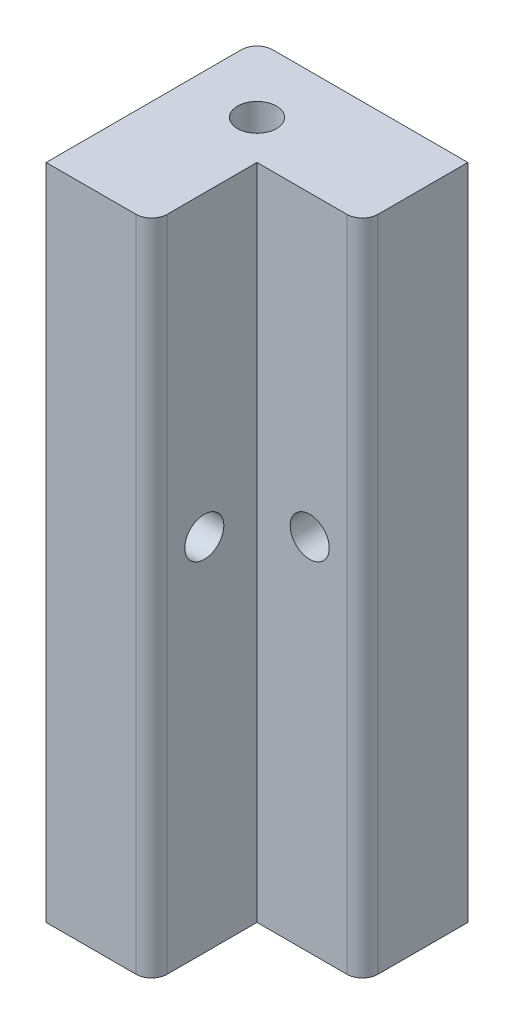
ISO-10303-21;
HEADER;
FILE_DESCRIPTION(('STEP AP214'),'2;1');
FILE_NAME('part.step','',(''),(''),'','','');
FILE_SCHEMA(('AUTOMOTIVE_DESIGN { 1 0 10303 214 1 1 1 1 }'));
ENDSEC;
DATA;
#1=APPLICATION_CONTEXT('core data for automotive mechanical design processes');
#2=APPLICATION_PROTOCOL_DEFINITION('international standard','automotive_design',2000,#1);
#3=PRODUCT_CONTEXT('',#1,'mechanical');
#4=PRODUCT('Part','Part','',(#3));
#5=PRODUCT_RELATED_PRODUCT_CATEGORY('part','',(#4));
#6=PRODUCT_DEFINITION_FORMATION('','',#4);
#7=PRODUCT_DEFINITION_CONTEXT('part definition',#1,'design');
#8=PRODUCT_DEFINITION('design','',#6,#7);
#9=PRODUCT_DEFINITION_SHAPE('','',#8);
#10=(LENGTH_UNIT() NAMED_UNIT(*) SI_UNIT(.MILLI.,.METRE.));
#11=(NAMED_UNIT(*) PLANE_ANGLE_UNIT() SI_UNIT($,.RADIAN.));
#12=(NAMED_UNIT(*) SI_UNIT($,.STERADIAN.) SOLID_ANGLE_UNIT());
#13=UNCERTAINTY_MEASURE_WITH_UNIT(LENGTH_MEASURE(1.E-05),#10,'distance_accuracy_value','');
#14=(GEOMETRIC_REPRESENTATION_CONTEXT(3) GLOBAL_UNCERTAINTY_ASSIGNED_CONTEXT((#13)) GLOBAL_UNIT_ASSIGNED_CONTEXT((#10,
#11,#12)) REPRESENTATION_CONTEXT('',''));
#15=CARTESIAN_POINT('',(0.,0.,0.));
#16=DIRECTION('',(0.,0.,1.));
#17=DIRECTION('',(1.,0.,0.));
#18=AXIS2_PLACEMENT_3D('',#15,#16,#17);
#19=CARTESIAN_POINT('',(5.,83.3618830920393,-8.5));
#20=DIRECTION('',(-1.,0.,0.));
#21=DIRECTION('',(0.,0.,1.));
#22=AXIS2_PLACEMENT_3D('',#19,#20,#21);
#23=PLANE('',#22);
#24=CARTESIAN_POINT('',(5.,46.1350000000003,11.75));
#25=DIRECTION('',(-1.,0.,0.));
#26=DIRECTION('',(0.,0.,1.));
#27=AXIS2_PLACEMENT_3D('',#24,#25,#26);
#28=CIRCLE('',#27,2.5);
#29=CARTESIAN_POINT('',(5.,46.1350000000003,14.25));
#30=VERTEX_POINT('',#29);
#31=EDGE_CURVE('E201',#30,#30,#28,.T.);
#32=ORIENTED_EDGE('',*,*,#31,.T.);
#33=EDGE_LOOP('',(#32));
#34=FACE_BOUND('',#33,.T.);
#35=DIRECTION('',(0.,-1.,0.));
#36=VECTOR('',#35,1.);
#37=CARTESIAN_POINT('',(5.,64.2700000000025,5.));
#38=LINE('',#37,#36);
#39=CARTESIAN_POINT('',(4.99999999999993,84.2700000000025,5.00000000000007));
#40=VERTEX_POINT('',#39);
#41=CARTESIAN_POINT('',(5.,0.,4.99999999999999));
#42=VERTEX_POINT('',#41);
#43=EDGE_CURVE('E128',#40,#42,#38,.T.);
#44=ORIENTED_EDGE('',*,*,#43,.F.);
#45=DIRECTION('',(0.,0.,-1.));
#46=VECTOR('',#45,1.);
#47=CARTESIAN_POINT('',(4.99999999999993,84.2700000000025,3.08297844300654E-13));
#48=LINE('',#47,#46);
#49=CARTESIAN_POINT('',(4.99999999999993,84.2700000000024,16.5000000000001));
#50=VERTEX_POINT('',#49);
#51=EDGE_CURVE('E131',#50,#40,#48,.T.);
#52=ORIENTED_EDGE('',*,*,#51,.F.);
#53=DIRECTION('',(0.,1.,0.));
#54=VECTOR('',#53,1.);
#55=CARTESIAN_POINT('',(5.,83.3618830920393,16.5));
#56=LINE('',#55,#54);
#57=CARTESIAN_POINT('',(5.,0.,16.5));
#58=VERTEX_POINT('',#57);
#59=EDGE_CURVE('E232',#50,#58,#56,.F.);
#60=ORIENTED_EDGE('',*,*,#59,.T.);
#61=DIRECTION('',(0.,0.,-1.));
#62=VECTOR('',#61,1.);
#63=CARTESIAN_POINT('',(5.,0.,-8.5));
#64=LINE('',#63,#62);
#65=EDGE_CURVE('E133',#58,#42,#64,.T.);
#66=ORIENTED_EDGE('',*,*,#65,.T.);
#67=EDGE_LOOP('',(#44,#52,#60,#66));
#68=FACE_BOUND('',#67,.T.);
#69=ADVANCED_FACE('F40',(#34,#68),#23,.F.);
#70=CARTESIAN_POINT('',(0.,0.,0.));
#71=DIRECTION('',(0.,-1.,0.));
#72=DIRECTION('',(0.,0.,-1.));
#73=AXIS2_PLACEMENT_3D('',#70,#71,#72);
#74=PLANE('',#73);
#75=DIRECTION('',(0.,0.,-1.));
#76=VECTOR('',#75,1.);
#77=CARTESIAN_POINT('',(18.5,0.,-8.5));
#78=LINE('',#77,#76);
#79=CARTESIAN_POINT('',(18.5,0.,2.99999999999999));
#80=VERTEX_POINT('',#79);
#81=CARTESIAN_POINT('',(18.5,0.,-8.5));
#82=VERTEX_POINT('',#81);
#83=EDGE_CURVE('E194',#80,#82,#78,.T.);
#84=ORIENTED_EDGE('',*,*,#83,.F.);
#85=CARTESIAN_POINT('',(16.5,0.,2.99999999999999));
#86=DIRECTION('',(0.,-1.,0.));
#87=DIRECTION('',(0.,0.,-1.));
#88=AXIS2_PLACEMENT_3D('',#85,#86,#87);
#89=CIRCLE('',#88,2.);
#90=CARTESIAN_POINT('',(16.5,0.,4.99999999999999));
#91=VERTEX_POINT('',#90);
#92=EDGE_CURVE('E49',#80,#91,#89,.T.);
#93=ORIENTED_EDGE('',*,*,#92,.T.);
#94=DIRECTION('',(-1.,0.,0.));
#95=VECTOR('',#94,1.);
#96=CARTESIAN_POINT('',(18.5,0.,4.99999999999999));
#97=LINE('',#96,#95);
#98=EDGE_CURVE('E196',#91,#42,#97,.T.);
#99=ORIENTED_EDGE('',*,*,#98,.T.);
#100=ORIENTED_EDGE('',*,*,#65,.F.);
#101=CARTESIAN_POINT('',(3.,0.,16.5));
#102=DIRECTION('',(0.,-1.,0.));
#103=DIRECTION('',(0.,0.,-1.));
#104=AXIS2_PLACEMENT_3D('',#101,#102,#103);
#105=CIRCLE('',#104,2.);
#106=CARTESIAN_POINT('',(3.,0.,18.5));
#107=VERTEX_POINT('',#106);
#108=EDGE_CURVE('E237',#58,#107,#105,.T.);
#109=ORIENTED_EDGE('',*,*,#108,.T.);
#110=DIRECTION('',(1.,0.,0.));
#111=VECTOR('',#110,1.);
#112=CARTESIAN_POINT('',(5.,0.,18.5));
#113=LINE('',#112,#111);
#114=CARTESIAN_POINT('',(-8.5,0.,18.5));
#115=VERTEX_POINT('',#114);
#116=EDGE_CURVE('E212',#115,#107,#113,.T.);
#117=ORIENTED_EDGE('',*,*,#116,.F.);
#118=DIRECTION('',(0.,0.,1.));
#119=VECTOR('',#118,1.);
#120=CARTESIAN_POINT('',(-8.5,0.,5.));
#121=LINE('',#120,#119);
#122=CARTESIAN_POINT('',(-8.5,0.,-6.5));
#123=VERTEX_POINT('',#122);
#124=EDGE_CURVE('E224',#123,#115,#121,.T.);
#125=ORIENTED_EDGE('',*,*,#124,.F.);
#126=CARTESIAN_POINT('',(-6.5,0.,-6.5));
#127=DIRECTION('',(0.,-1.,0.));
#128=DIRECTION('',(0.,0.,-1.));
#129=AXIS2_PLACEMENT_3D('',#126,#127,#128);
#130=CIRCLE('',#129,2.);
#131=CARTESIAN_POINT('',(-6.5,0.,-8.5));
#132=VERTEX_POINT('',#131);
#133=EDGE_CURVE('E234',#123,#132,#130,.T.);
#134=ORIENTED_EDGE('',*,*,#133,.T.);
#135=DIRECTION('',(-1.,0.,0.));
#136=VECTOR('',#135,1.);
#137=CARTESIAN_POINT('',(-8.5,0.,-8.5));
#138=LINE('',#137,#136);
#139=EDGE_CURVE('E217',#82,#132,#138,.T.);
#140=ORIENTED_EDGE('',*,*,#139,.F.);
#141=EDGE_LOOP('',(#84,#93,#99,#100,#109,#117,#125,#134,#140));
#142=FACE_BOUND('',#141,.T.);
#143=CARTESIAN_POINT('',(0.,0.,0.));
#144=DIRECTION('',(0.,1.,0.));
#145=DIRECTION('',(0.,0.,1.));
#146=AXIS2_PLACEMENT_3D('',#143,#144,#145);
#147=CIRCLE('',#146,2.5);
#148=CARTESIAN_POINT('',(0.,0.,-2.5));
#149=VERTEX_POINT('',#148);
#150=EDGE_CURVE('E216',#149,#149,#147,.T.);
#151=ORIENTED_EDGE('',*,*,#150,.T.);
#152=EDGE_LOOP('',(#151));
#153=FACE_BOUND('',#152,.T.);
#154=ADVANCED_FACE('F254',(#142,#153),#74,.T.);
#155=CARTESIAN_POINT('',(-8.5,83.3618830920393,5.));
#156=DIRECTION('',(1.,0.,0.));
#157=DIRECTION('',(0.,0.,-1.));
#158=AXIS2_PLACEMENT_3D('',#155,#156,#157);
#159=PLANE('',#158);
#160=CARTESIAN_POINT('',(-8.5,46.1350000000003,11.75));
#161=DIRECTION('',(-1.,0.,0.));
#162=DIRECTION('',(0.,0.,1.));
#163=AXIS2_PLACEMENT_3D('',#160,#161,#162);
#164=CIRCLE('',#163,2.5);
#165=CARTESIAN_POINT('',(-8.5,46.1350000000003,14.25));
#166=VERTEX_POINT('',#165);
#167=EDGE_CURVE('E200',#166,#166,#164,.T.);
#168=ORIENTED_EDGE('',*,*,#167,.F.);
#169=EDGE_LOOP('',(#168));
#170=FACE_BOUND('',#169,.T.);
#171=DIRECTION('',(0.,-1.,0.));
#172=VECTOR('',#171,1.);
#173=CARTESIAN_POINT('',(-8.5,0.,18.5));
#174=LINE('',#173,#172);
#175=CARTESIAN_POINT('',(-8.50000000000007,84.2700000000024,18.5000000000001));
#176=VERTEX_POINT('',#175);
#177=EDGE_CURVE('E205',#176,#115,#174,.T.);
#178=ORIENTED_EDGE('',*,*,#177,.F.);
#179=DIRECTION('',(0.,0.,1.));
#180=VECTOR('',#179,1.);
#181=CARTESIAN_POINT('',(-8.50000000000007,84.2700000000025,3.08940334476942E-13));
#182=LINE('',#181,#180);
#183=CARTESIAN_POINT('',(-8.50000000000007,84.2700000000025,-6.49999999999993));
#184=VERTEX_POINT('',#183);
#185=EDGE_CURVE('E173',#184,#176,#182,.T.);
#186=ORIENTED_EDGE('',*,*,#185,.F.);
#187=DIRECTION('',(0.,-1.,0.));
#188=VECTOR('',#187,1.);
#189=CARTESIAN_POINT('',(-8.5,83.3618830920393,-6.5));
#190=LINE('',#189,#188);
#191=EDGE_CURVE('E240',#184,#123,#190,.T.);
#192=ORIENTED_EDGE('',*,*,#191,.T.);
#193=ORIENTED_EDGE('',*,*,#124,.T.);
#194=EDGE_LOOP('',(#178,#186,#192,#193));
#195=FACE_BOUND('',#194,.T.);
#196=ADVANCED_FACE('F278',(#170,#195),#159,.F.);
#197=CARTESIAN_POINT('',(-8.5,83.3618830920393,-8.5));
#198=DIRECTION('',(0.,0.,1.));
#199=DIRECTION('',(1.,0.,0.));
#200=AXIS2_PLACEMENT_3D('',#197,#198,#199);
#201=PLANE('',#200);
#202=CARTESIAN_POINT('',(11.75,46.1350000000025,-8.5));
#203=DIRECTION('',(0.,0.,-1.));
#204=DIRECTION('',(-1.,0.,0.));
#205=AXIS2_PLACEMENT_3D('',#202,#203,#204);
#206=CIRCLE('',#205,2.5);
#207=CARTESIAN_POINT('',(9.25,46.1350000000025,-8.5));
#208=VERTEX_POINT('',#207);
#209=EDGE_CURVE('E185',#208,#208,#206,.T.);
#210=ORIENTED_EDGE('',*,*,#209,.F.);
#211=EDGE_LOOP('',(#210));
#212=FACE_BOUND('',#211,.T.);
#213=ORIENTED_EDGE('',*,*,#139,.T.);
#214=DIRECTION('',(0.,-1.,0.));
#215=VECTOR('',#214,1.);
#216=CARTESIAN_POINT('',(-6.5,83.3618830920393,-8.5));
#217=LINE('',#216,#215);
#218=CARTESIAN_POINT('',(-6.50000000000007,84.2700000000025,-8.49999999999993));
#219=VERTEX_POINT('',#218);
#220=EDGE_CURVE('E244',#132,#219,#217,.F.);
#221=ORIENTED_EDGE('',*,*,#220,.T.);
#222=DIRECTION('',(-1.,0.,0.));
#223=VECTOR('',#222,1.);
#224=CARTESIAN_POINT('',(-3.08940334476942E-13,84.2700000000025,-8.49999999999993));
#225=LINE('',#224,#223);
#226=CARTESIAN_POINT('',(18.4999999999999,84.2700000000026,-8.49999999999993));
#227=VERTEX_POINT('',#226);
#228=EDGE_CURVE('E165',#227,#219,#225,.T.);
#229=ORIENTED_EDGE('',*,*,#228,.F.);
#230=DIRECTION('',(0.,1.,0.));
#231=VECTOR('',#230,1.);
#232=CARTESIAN_POINT('',(18.5,64.2700000000025,-8.5));
#233=LINE('',#232,#231);
#234=EDGE_CURVE('E136',#82,#227,#233,.T.);
#235=ORIENTED_EDGE('',*,*,#234,.F.);
#236=EDGE_LOOP('',(#213,#221,#229,#235));
#237=FACE_BOUND('',#236,.T.);
#238=ADVANCED_FACE('F261',(#212,#237),#201,.F.);
#239=CARTESIAN_POINT('',(0.,83.3618830920393,0.));
#240=DIRECTION('',(0.,-1.,0.));
#241=DIRECTION('',(0.,0.,-1.));
#242=AXIS2_PLACEMENT_3D('',#239,#240,#241);
#243=CYLINDRICAL_SURFACE('',#242,2.5);
#244=CARTESIAN_POINT('',(0.,84.2700000000025,0.));
#245=DIRECTION('',(0.,1.,0.));
#246=DIRECTION('',(0.,0.,1.));
#247=AXIS2_PLACEMENT_3D('',#244,#245,#246);
#248=CIRCLE('',#247,2.5);
#249=CARTESIAN_POINT('',(0.,84.2700000000025,-2.5));
#250=VERTEX_POINT('',#249);
#251=EDGE_CURVE('E181',#250,#250,#248,.F.);
#252=CARTESIAN_POINT('',(0.,0.,-2.5));
#253=CARTESIAN_POINT('',(0.,0.877812500000015,-2.5));
#254=CARTESIAN_POINT('',(0.,1.75562500000004,-2.5));
#255=CARTESIAN_POINT('',(0.,3.5112500000001,-2.5));
#256=CARTESIAN_POINT('',(0.,4.38906250000012,-2.5));
#257=CARTESIAN_POINT('',(0.,6.14468750000017,-2.5));
#258=CARTESIAN_POINT('',(0.,7.0225000000002,-2.5));
#259=CARTESIAN_POINT('',(0.,8.77812500000025,-2.5));
#260=CARTESIAN_POINT('',(0.,9.65593750000028,-2.5));
#261=CARTESIAN_POINT('',(0.,11.4115625000003,-2.5));
#262=CARTESIAN_POINT('',(0.,12.2893750000004,-2.5));
#263=CARTESIAN_POINT('',(0.,14.0450000000004,-2.5));
#264=CARTESIAN_POINT('',(0.,14.9228125000004,-2.5));
#265=CARTESIAN_POINT('',(0.,16.6784375000005,-2.5));
#266=CARTESIAN_POINT('',(0.,17.5562500000005,-2.5));
#267=CARTESIAN_POINT('',(0.,19.3118750000006,-2.5));
#268=CARTESIAN_POINT('',(0.,20.1896875000006,-2.5));
#269=CARTESIAN_POINT('',(0.,21.9453125000006,-2.5));
#270=CARTESIAN_POINT('',(0.,22.8231250000007,-2.5));
#271=CARTESIAN_POINT('',(0.,24.5787500000007,-2.5));
#272=CARTESIAN_POINT('',(0.,25.4565625000007,-2.5));
#273=CARTESIAN_POINT('',(0.,27.2121875000008,-2.5));
#274=CARTESIAN_POINT('',(0.,28.0900000000008,-2.5));
#275=CARTESIAN_POINT('',(0.,29.8456250000009,-2.5));
#276=CARTESIAN_POINT('',(0.,30.7234375000009,-2.5));
#277=CARTESIAN_POINT('',(0.,32.4790625000009,-2.5));
#278=CARTESIAN_POINT('',(0.,33.356875000001,-2.5));
#279=CARTESIAN_POINT('',(0.,35.112500000001,-2.5));
#280=CARTESIAN_POINT('',(0.,35.9903125000011,-2.5));
#281=CARTESIAN_POINT('',(0.,37.7459375000011,-2.5));
#282=CARTESIAN_POINT('',(0.,38.6237500000011,-2.5));
#283=CARTESIAN_POINT('',(0.,40.3793750000012,-2.5));
#284=CARTESIAN_POINT('',(0.,41.2571875000012,-2.5));
#285=CARTESIAN_POINT('',(0.,43.0128125000013,-2.5));
#286=CARTESIAN_POINT('',(0.,43.8906250000013,-2.5));
#287=CARTESIAN_POINT('',(0.,45.6462500000013,-2.5));
#288=CARTESIAN_POINT('',(0.,46.5240625000014,-2.5));
#289=CARTESIAN_POINT('',(0.,48.2796875000014,-2.5));
#290=CARTESIAN_POINT('',(0.,49.1575000000014,-2.5));
#291=CARTESIAN_POINT('',(0.,50.9131250000015,-2.5));
#292=CARTESIAN_POINT('',(0.,51.7909375000015,-2.5));
#293=CARTESIAN_POINT('',(0.,53.5465625000016,-2.5));
#294=CARTESIAN_POINT('',(0.,54.4243750000016,-2.5));
#295=CARTESIAN_POINT('',(0.,56.1800000000017,-2.5));
#296=CARTESIAN_POINT('',(0.,57.0578125000017,-2.5));
#297=CARTESIAN_POINT('',(0.,58.8134375000017,-2.5));
#298=CARTESIAN_POINT('',(0.,59.6912500000018,-2.5));
#299=CARTESIAN_POINT('',(0.,61.4468750000018,-2.5));
#300=CARTESIAN_POINT('',(0.,62.3246875000018,-2.5));
#301=CARTESIAN_POINT('',(0.,64.0803125000019,-2.5));
#302=CARTESIAN_POINT('',(0.,64.9581250000019,-2.5));
#303=CARTESIAN_POINT('',(0.,66.713750000002,-2.5));
#304=CARTESIAN_POINT('',(0.,67.591562500002,-2.5));
#305=CARTESIAN_POINT('',(0.,69.3471875000021,-2.5));
#306=CARTESIAN_POINT('',(0.,70.2250000000021,-2.5));
#307=CARTESIAN_POINT('',(0.,71.9806250000021,-2.5));
#308=CARTESIAN_POINT('',(0.,72.8584375000022,-2.5));
#309=CARTESIAN_POINT('',(0.,74.6140625000022,-2.5));
#310=CARTESIAN_POINT('',(0.,75.4918750000022,-2.5));
#311=CARTESIAN_POINT('',(0.,77.2475000000023,-2.5));
#312=CARTESIAN_POINT('',(0.,78.1253125000023,-2.5));
#313=CARTESIAN_POINT('',(0.,79.8809375000024,-2.5));
#314=CARTESIAN_POINT('',(0.,80.7587500000024,-2.5));
#315=CARTESIAN_POINT('',(0.,82.5143750000024,-2.5));
#316=CARTESIAN_POINT('',(0.,83.3921875000025,-2.5));
#317=CARTESIAN_POINT('',(0.,84.2700000000025,-2.5));
#318=B_SPLINE_CURVE_WITH_KNOTS('',3,(#252,#253,#254,#255,#256,#257,#258,#259,#260,#261,#262,
#263,#264,#265,#266,#267,#268,#269,#270,#271,#272,#273,#274,#275,#276,#277,#278,#279,#280,#281,
#282,#283,#284,#285,#286,#287,#288,#289,#290,#291,#292,#293,#294,#295,#296,#297,#298,#299,#300,
#301,#302,#303,#304,#305,#306,#307,#308,#309,#310,#311,#312,#313,#314,#315,#316,#317),
.UNSPECIFIED.,.F.,.F.,(4,2,2,2,2,2,2,2,2,2,2,2,2,2,2,2,2,2,2,2,2,2,2,2,2,2,2,2,2,2,2,2,4),(0.,
2.63343750000009,5.26687500000016,7.90031250000024,10.5337500000003,13.1671875000004,
15.8006250000005,18.4340625000006,21.0675000000006,23.7009375000007,26.3343750000008,
28.9678125000009,31.6012500000009,34.234687500001,36.8681250000011,39.5015625000012,
42.1350000000013,44.7684375000013,47.4018750000014,50.0353125000015,52.6687500000016,
55.3021875000016,57.9356250000017,60.5690625000018,63.2025000000019,65.8359375000019,
68.469375000002,71.1028125000021,73.7362500000022,76.3696875000023,79.0031250000024,
81.6365625000024,84.2700000000025),.UNSPECIFIED.);
#319=EDGE_CURVE('BSEAM285',#149,#250,#318,.T.);
#320=ORIENTED_EDGE('',*,*,#150,.F.);
#321=ORIENTED_EDGE('',*,*,#251,.F.);
#322=ORIENTED_EDGE('',*,*,#319,.T.);
#323=ORIENTED_EDGE('',*,*,#319,.F.);
#324=EDGE_LOOP('',(#320,#322,#321,#323));
#325=FACE_BOUND('',#324,.T.);
#326=ADVANCED_FACE('F285',(#325),#243,.F.);
#327=CARTESIAN_POINT('',(0.,0.,18.5));
#328=DIRECTION('',(0.,0.,-1.));
#329=DIRECTION('',(-1.,0.,0.));
#330=AXIS2_PLACEMENT_3D('',#327,#328,#329);
#331=PLANE('',#330);
#332=ORIENTED_EDGE('',*,*,#116,.T.);
#333=DIRECTION('',(0.,1.,0.));
#334=VECTOR('',#333,1.);
#335=CARTESIAN_POINT('',(3.,0.,18.5));
#336=LINE('',#335,#334);
#337=CARTESIAN_POINT('',(2.99999999999993,84.2700000000024,18.5000000000001));
#338=VERTEX_POINT('',#337);
#339=EDGE_CURVE('E221',#107,#338,#336,.T.);
#340=ORIENTED_EDGE('',*,*,#339,.T.);
#341=DIRECTION('',(1.,0.,0.));
#342=VECTOR('',#341,1.);
#343=CARTESIAN_POINT('',(-3.08940334476942E-13,84.2700000000024,18.5000000000001));
#344=LINE('',#343,#342);
#345=EDGE_CURVE('E177',#176,#338,#344,.T.);
#346=ORIENTED_EDGE('',*,*,#345,.F.);
#347=ORIENTED_EDGE('',*,*,#177,.T.);
#348=EDGE_LOOP('',(#332,#340,#346,#347));
#349=FACE_BOUND('',#348,.T.);
#350=ADVANCED_FACE('F288',(#349),#331,.F.);
#351=CARTESIAN_POINT('',(3.,0.,16.5));
#352=DIRECTION('',(0.,1.,0.));
#353=DIRECTION('',(0.,0.,1.));
#354=AXIS2_PLACEMENT_3D('',#351,#352,#353);
#355=CYLINDRICAL_SURFACE('',#354,2.);
#356=ORIENTED_EDGE('',*,*,#108,.F.);
#357=ORIENTED_EDGE('',*,*,#59,.F.);
#358=CARTESIAN_POINT('',(2.99999999999993,84.2700000000024,16.5000000000001));
#359=DIRECTION('',(0.,1.,0.));
#360=DIRECTION('',(0.,0.,1.));
#361=AXIS2_PLACEMENT_3D('',#358,#359,#360);
#362=CIRCLE('',#361,2.);
#363=EDGE_CURVE('E153',#338,#50,#362,.T.);
#364=ORIENTED_EDGE('',*,*,#363,.F.);
#365=ORIENTED_EDGE('',*,*,#339,.F.);
#366=EDGE_LOOP('',(#356,#357,#364,#365));
#367=FACE_BOUND('',#366,.T.);
#368=ADVANCED_FACE('F290',(#367),#355,.T.);
#369=CARTESIAN_POINT('',(-6.5,83.3618830920393,-6.5));
#370=DIRECTION('',(0.,-1.,0.));
#371=DIRECTION('',(0.,0.,-1.));
#372=AXIS2_PLACEMENT_3D('',#369,#370,#371);
#373=CYLINDRICAL_SURFACE('',#372,2.);
#374=ORIENTED_EDGE('',*,*,#191,.F.);
#375=CARTESIAN_POINT('',(-6.50000000000007,84.2700000000025,-6.49999999999993));
#376=DIRECTION('',(0.,1.,0.));
#377=DIRECTION('',(0.,0.,1.));
#378=AXIS2_PLACEMENT_3D('',#375,#376,#377);
#379=CIRCLE('',#378,2.);
#380=EDGE_CURVE('E169',#219,#184,#379,.T.);
#381=ORIENTED_EDGE('',*,*,#380,.F.);
#382=ORIENTED_EDGE('',*,*,#220,.F.);
#383=ORIENTED_EDGE('',*,*,#133,.F.);
#384=EDGE_LOOP('',(#374,#381,#382,#383));
#385=FACE_BOUND('',#384,.T.);
#386=ADVANCED_FACE('F292',(#385),#373,.T.);
#387=CARTESIAN_POINT('',(5.,46.1350000000003,11.75));
#388=DIRECTION('',(-1.,0.,0.));
#389=DIRECTION('',(0.,0.,1.));
#390=AXIS2_PLACEMENT_3D('',#387,#388,#389);
#391=CYLINDRICAL_SURFACE('',#390,2.5);
#392=ORIENTED_EDGE('',*,*,#167,.T.);
#393=EDGE_LOOP('',(#392));
#394=FACE_BOUND('',#393,.T.);
#395=ORIENTED_EDGE('',*,*,#31,.F.);
#396=EDGE_LOOP('',(#395));
#397=FACE_BOUND('',#396,.T.);
#398=ADVANCED_FACE('F295',(#394,#397),#391,.F.);
#399=CARTESIAN_POINT('',(18.5,64.2700000000025,5.));
#400=DIRECTION('',(0.,0.,-1.));
#401=DIRECTION('',(0.,1.,0.));
#402=AXIS2_PLACEMENT_3D('',#399,#400,#401);
#403=PLANE('',#402);
#404=CARTESIAN_POINT('',(11.75,46.1350000000025,5.));
#405=DIRECTION('',(0.,0.,-1.));
#406=DIRECTION('',(-1.,0.,0.));
#407=AXIS2_PLACEMENT_3D('',#404,#405,#406);
#408=CIRCLE('',#407,2.5);
#409=CARTESIAN_POINT('',(9.25,46.1350000000025,5.));
#410=VERTEX_POINT('',#409);
#411=EDGE_CURVE('E137',#410,#410,#408,.T.);
#412=ORIENTED_EDGE('',*,*,#411,.T.);
#413=EDGE_LOOP('',(#412));
#414=FACE_BOUND('',#413,.T.);
#415=ORIENTED_EDGE('',*,*,#98,.F.);
#416=DIRECTION('',(0.,-1.,0.));
#417=VECTOR('',#416,1.);
#418=CARTESIAN_POINT('',(16.5,64.2700000000025,5.));
#419=LINE('',#418,#417);
#420=CARTESIAN_POINT('',(16.4999999999999,84.2700000000025,5.00000000000007));
#421=VERTEX_POINT('',#420);
#422=EDGE_CURVE('E11',#91,#421,#419,.F.);
#423=ORIENTED_EDGE('',*,*,#422,.T.);
#424=DIRECTION('',(1.,0.,0.));
#425=VECTOR('',#424,1.);
#426=CARTESIAN_POINT('',(-3.08297844300654E-13,84.2700000000025,5.00000000000007));
#427=LINE('',#426,#425);
#428=EDGE_CURVE('E140',#40,#421,#427,.T.);
#429=ORIENTED_EDGE('',*,*,#428,.F.);
#430=ORIENTED_EDGE('',*,*,#43,.T.);
#431=EDGE_LOOP('',(#415,#423,#429,#430));
#432=FACE_BOUND('',#431,.T.);
#433=ADVANCED_FACE('F141',(#414,#432),#403,.F.);
#434=CARTESIAN_POINT('',(18.5,0.,0.));
#435=DIRECTION('',(-1.,0.,0.));
#436=DIRECTION('',(0.,0.,1.));
#437=AXIS2_PLACEMENT_3D('',#434,#435,#436);
#438=PLANE('',#437);
#439=ORIENTED_EDGE('',*,*,#234,.T.);
#440=DIRECTION('',(0.,0.,-1.));
#441=VECTOR('',#440,1.);
#442=CARTESIAN_POINT('',(18.4999999999999,84.2700000000026,3.06563120824677E-13));
#443=LINE('',#442,#441);
#444=CARTESIAN_POINT('',(18.4999999999999,84.2700000000025,3.00000000000007));
#445=VERTEX_POINT('',#444);
#446=EDGE_CURVE('E161',#445,#227,#443,.T.);
#447=ORIENTED_EDGE('',*,*,#446,.F.);
#448=DIRECTION('',(0.,-1.,0.));
#449=VECTOR('',#448,1.);
#450=CARTESIAN_POINT('',(18.5,0.,2.99999999999999));
#451=LINE('',#450,#449);
#452=EDGE_CURVE('E247',#445,#80,#451,.T.);
#453=ORIENTED_EDGE('',*,*,#452,.T.);
#454=ORIENTED_EDGE('',*,*,#83,.T.);
#455=EDGE_LOOP('',(#439,#447,#453,#454));
#456=FACE_BOUND('',#455,.T.);
#457=ADVANCED_FACE('F252',(#456),#438,.F.);
#458=CARTESIAN_POINT('',(11.75,46.1350000000025,5.));
#459=DIRECTION('',(0.,0.,-1.));
#460=DIRECTION('',(-1.,0.,0.));
#461=AXIS2_PLACEMENT_3D('',#458,#459,#460);
#462=CYLINDRICAL_SURFACE('',#461,2.5);
#463=ORIENTED_EDGE('',*,*,#411,.F.);
#464=EDGE_LOOP('',(#463));
#465=FACE_BOUND('',#464,.T.);
#466=ORIENTED_EDGE('',*,*,#209,.T.);
#467=EDGE_LOOP('',(#466));
#468=FACE_BOUND('',#467,.T.);
#469=ADVANCED_FACE('F264',(#465,#468),#462,.F.);
#470=CARTESIAN_POINT('',(16.5,0.,2.99999999999999));
#471=DIRECTION('',(0.,-1.,0.));
#472=DIRECTION('',(0.,0.,-1.));
#473=AXIS2_PLACEMENT_3D('',#470,#471,#472);
#474=CYLINDRICAL_SURFACE('',#473,2.);
#475=ORIENTED_EDGE('',*,*,#452,.F.);
#476=CARTESIAN_POINT('',(16.4999999999999,84.2700000000025,3.00000000000007));
#477=DIRECTION('',(0.,1.,0.));
#478=DIRECTION('',(0.,0.,1.));
#479=AXIS2_PLACEMENT_3D('',#476,#477,#478);
#480=CIRCLE('',#479,2.);
#481=EDGE_CURVE('E146',#421,#445,#480,.T.);
#482=ORIENTED_EDGE('',*,*,#481,.F.);
#483=ORIENTED_EDGE('',*,*,#422,.F.);
#484=ORIENTED_EDGE('',*,*,#92,.F.);
#485=EDGE_LOOP('',(#475,#482,#483,#484));
#486=FACE_BOUND('',#485,.T.);
#487=ADVANCED_FACE('F42',(#486),#474,.T.);
#488=CARTESIAN_POINT('',(-3.08940334476942E-13,84.2700000000025,3.08940334476942E-13));
#489=DIRECTION('',(0.,1.,0.));
#490=DIRECTION('',(0.,0.,1.));
#491=AXIS2_PLACEMENT_3D('',#488,#489,#490);
#492=PLANE('',#491);
#493=ORIENTED_EDGE('',*,*,#51,.T.);
#494=ORIENTED_EDGE('',*,*,#428,.T.);
#495=ORIENTED_EDGE('',*,*,#481,.T.);
#496=ORIENTED_EDGE('',*,*,#446,.T.);
#497=ORIENTED_EDGE('',*,*,#228,.T.);
#498=ORIENTED_EDGE('',*,*,#380,.T.);
#499=ORIENTED_EDGE('',*,*,#185,.T.);
#500=ORIENTED_EDGE('',*,*,#345,.T.);
#501=ORIENTED_EDGE('',*,*,#363,.T.);
#502=EDGE_LOOP('',(#493,#494,#495,#496,#497,#498,#499,#500,#501));
#503=FACE_BOUND('',#502,.T.);
#504=ORIENTED_EDGE('',*,*,#251,.T.);
#505=EDGE_LOOP('',(#504));
#506=FACE_BOUND('',#505,.T.);
#507=ADVANCED_FACE('F149',(#503,#506),#492,.T.);
#508=CLOSED_SHELL('',(#69,#154,#196,#238,#326,#350,#368,#386,#398,#433,#457,#469,#487,#507));
#509=MANIFOLD_SOLID_BREP('B2',#508);
#510=ADVANCED_BREP_SHAPE_REPRESENTATION('',(#18,#509),#14);
#511=SHAPE_DEFINITION_REPRESENTATION(#9,#510);
ENDSEC;
END-ISO-10303-21;
